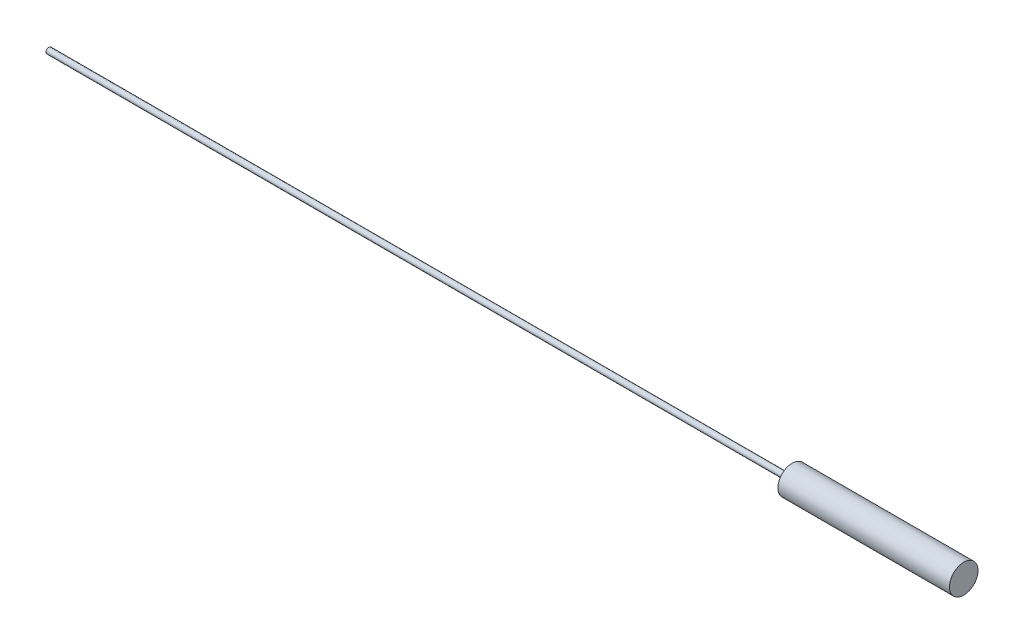
ISO-10303-21;
HEADER;
FILE_DESCRIPTION(('STEP AP214'),'2;1');
FILE_NAME('part.step','',(''),(''),'','','');
FILE_SCHEMA(('AUTOMOTIVE_DESIGN { 1 0 10303 214 1 1 1 1 }'));
ENDSEC;
DATA;
#1=APPLICATION_CONTEXT('core data for automotive mechanical design processes');
#2=APPLICATION_PROTOCOL_DEFINITION('international standard','automotive_design',2000,#1);
#3=PRODUCT_CONTEXT('',#1,'mechanical');
#4=PRODUCT('Part','Part','',(#3));
#5=PRODUCT_RELATED_PRODUCT_CATEGORY('part','',(#4));
#6=PRODUCT_DEFINITION_FORMATION('','',#4);
#7=PRODUCT_DEFINITION_CONTEXT('part definition',#1,'design');
#8=PRODUCT_DEFINITION('design','',#6,#7);
#9=PRODUCT_DEFINITION_SHAPE('','',#8);
#10=(LENGTH_UNIT() NAMED_UNIT(*) SI_UNIT(.MILLI.,.METRE.));
#11=(NAMED_UNIT(*) PLANE_ANGLE_UNIT() SI_UNIT($,.RADIAN.));
#12=(NAMED_UNIT(*) SI_UNIT($,.STERADIAN.) SOLID_ANGLE_UNIT());
#13=UNCERTAINTY_MEASURE_WITH_UNIT(LENGTH_MEASURE(1.E-05),#10,'distance_accuracy_value','');
#14=(GEOMETRIC_REPRESENTATION_CONTEXT(3) GLOBAL_UNCERTAINTY_ASSIGNED_CONTEXT((#13)) GLOBAL_UNIT_ASSIGNED_CONTEXT((#10,
#11,#12)) REPRESENTATION_CONTEXT('',''));
#15=CARTESIAN_POINT('',(0.,0.,0.));
#16=DIRECTION('',(0.,0.,1.));
#17=DIRECTION('',(1.,0.,0.));
#18=AXIS2_PLACEMENT_3D('',#15,#16,#17);
#19=CARTESIAN_POINT('',(60.,0.,0.));
#20=DIRECTION('',(-1.,0.,0.));
#21=DIRECTION('',(0.,0.,1.));
#22=AXIS2_PLACEMENT_3D('',#19,#20,#21);
#23=PLANE('',#22);
#24=CARTESIAN_POINT('',(60.,0.,-3.42558521374258));
#25=DIRECTION('',(-1.,0.,0.));
#26=DIRECTION('',(0.,0.,1.));
#27=AXIS2_PLACEMENT_3D('',#24,#25,#26);
#28=CIRCLE('',#27,10.);
#29=CARTESIAN_POINT('',(60.,0.,6.57441478625742));
#30=VERTEX_POINT('',#29);
#31=EDGE_CURVE('E54',#30,#30,#28,.T.);
#32=ORIENTED_EDGE('',*,*,#31,.F.);
#33=EDGE_LOOP('',(#32));
#34=FACE_BOUND('',#33,.T.);
#35=ADVANCED_FACE('F41',(#34),#23,.F.);
#36=CARTESIAN_POINT('',(-60.,0.,0.));
#37=DIRECTION('',(-1.,0.,0.));
#38=DIRECTION('',(0.,0.,1.));
#39=AXIS2_PLACEMENT_3D('',#36,#37,#38);
#40=PLANE('',#39);
#41=CARTESIAN_POINT('',(-60.,0.,-3.42558521374258));
#42=DIRECTION('',(-1.,0.,0.));
#43=DIRECTION('',(0.,0.,1.));
#44=AXIS2_PLACEMENT_3D('',#41,#42,#43);
#45=CIRCLE('',#44,2.);
#46=CARTESIAN_POINT('',(-60.,0.,-1.42558521374258));
#47=VERTEX_POINT('',#46);
#48=EDGE_CURVE('E10',#47,#47,#45,.T.);
#49=ORIENTED_EDGE('',*,*,#48,.F.);
#50=EDGE_LOOP('',(#49));
#51=FACE_BOUND('',#50,.T.);
#52=CARTESIAN_POINT('',(-60.,0.,-3.42558521374258));
#53=DIRECTION('',(-1.,0.,0.));
#54=DIRECTION('',(0.,0.,1.));
#55=AXIS2_PLACEMENT_3D('',#52,#53,#54);
#56=CIRCLE('',#55,10.);
#57=CARTESIAN_POINT('',(-60.,0.,6.57441478625742));
#58=VERTEX_POINT('',#57);
#59=EDGE_CURVE('E44',#58,#58,#56,.T.);
#60=ORIENTED_EDGE('',*,*,#59,.T.);
#61=EDGE_LOOP('',(#60));
#62=FACE_BOUND('',#61,.T.);
#63=ADVANCED_FACE('F76',(#51,#62),#40,.T.);
#64=CARTESIAN_POINT('',(-60.,0.,-3.42558521374258));
#65=DIRECTION('',(-1.,0.,0.));
#66=DIRECTION('',(0.,0.,1.));
#67=AXIS2_PLACEMENT_3D('',#64,#65,#66);
#68=CYLINDRICAL_SURFACE('',#67,10.);
#69=ORIENTED_EDGE('',*,*,#31,.T.);
#70=EDGE_LOOP('',(#69));
#71=FACE_BOUND('',#70,.T.);
#72=ORIENTED_EDGE('',*,*,#59,.F.);
#73=EDGE_LOOP('',(#72));
#74=FACE_BOUND('',#73,.T.);
#75=ADVANCED_FACE('F69',(#71,#74),#68,.T.);
#76=CARTESIAN_POINT('',(-580.,0.,-3.42558521374258));
#77=DIRECTION('',(1.,0.,0.));
#78=DIRECTION('',(0.,0.,-1.));
#79=AXIS2_PLACEMENT_3D('',#76,#77,#78);
#80=CYLINDRICAL_SURFACE('',#79,2.);
#81=CARTESIAN_POINT('',(-580.,0.,-3.42558521374258));
#82=DIRECTION('',(-1.,0.,0.));
#83=DIRECTION('',(0.,0.,1.));
#84=AXIS2_PLACEMENT_3D('',#81,#82,#83);
#85=CIRCLE('',#84,2.);
#86=CARTESIAN_POINT('',(-580.,0.,-1.42558521374258));
#87=VERTEX_POINT('',#86);
#88=EDGE_CURVE('E56',#87,#87,#85,.T.);
#89=ORIENTED_EDGE('',*,*,#88,.F.);
#90=EDGE_LOOP('',(#89));
#91=FACE_BOUND('',#90,.T.);
#92=ORIENTED_EDGE('',*,*,#48,.T.);
#93=EDGE_LOOP('',(#92));
#94=FACE_BOUND('',#93,.T.);
#95=ADVANCED_FACE('F67',(#91,#94),#80,.T.);
#96=CARTESIAN_POINT('',(-580.,0.,-3.42558521374258));
#97=DIRECTION('',(-1.,0.,0.));
#98=DIRECTION('',(0.,0.,1.));
#99=AXIS2_PLACEMENT_3D('',#96,#97,#98);
#100=PLANE('',#99);
#101=ORIENTED_EDGE('',*,*,#88,.T.);
#102=EDGE_LOOP('',(#101));
#103=FACE_BOUND('',#102,.T.);
#104=ADVANCED_FACE('F65',(#103),#100,.T.);
#105=CLOSED_SHELL('',(#35,#63,#75,#95,#104));
#106=MANIFOLD_SOLID_BREP('B2',#105);
#107=ADVANCED_BREP_SHAPE_REPRESENTATION('',(#18,#106),#14);
#108=SHAPE_DEFINITION_REPRESENTATION(#9,#107);
ENDSEC;
END-ISO-10303-21;
